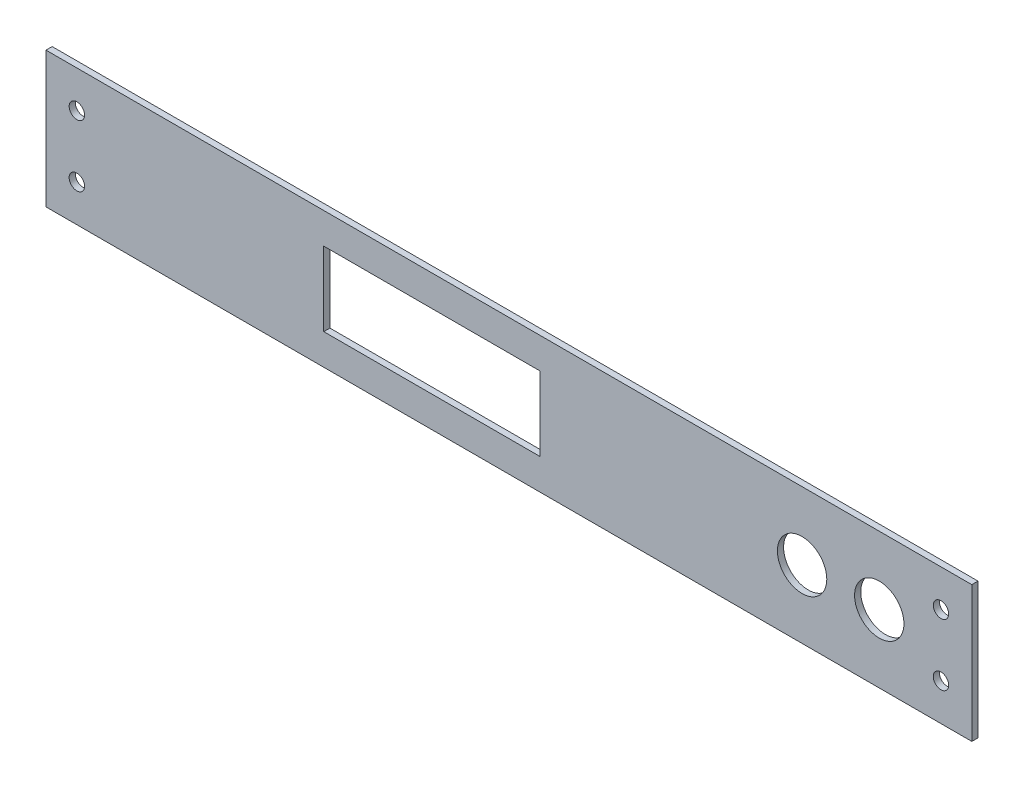
ISO-10303-21;
HEADER;
FILE_DESCRIPTION(('STEP AP214'),'2;1');
FILE_NAME('part.step','',(''),(''),'','','');
FILE_SCHEMA(('AUTOMOTIVE_DESIGN { 1 0 10303 214 1 1 1 1 }'));
ENDSEC;
DATA;
#1=APPLICATION_CONTEXT('core data for automotive mechanical design processes');
#2=APPLICATION_PROTOCOL_DEFINITION('international standard','automotive_design',2000,#1);
#3=PRODUCT_CONTEXT('',#1,'mechanical');
#4=PRODUCT('Part','Part','',(#3));
#5=PRODUCT_RELATED_PRODUCT_CATEGORY('part','',(#4));
#6=PRODUCT_DEFINITION_FORMATION('','',#4);
#7=PRODUCT_DEFINITION_CONTEXT('part definition',#1,'design');
#8=PRODUCT_DEFINITION('design','',#6,#7);
#9=PRODUCT_DEFINITION_SHAPE('','',#8);
#10=(LENGTH_UNIT() NAMED_UNIT(*) SI_UNIT(.MILLI.,.METRE.));
#11=(NAMED_UNIT(*) PLANE_ANGLE_UNIT() SI_UNIT($,.RADIAN.));
#12=(NAMED_UNIT(*) SI_UNIT($,.STERADIAN.) SOLID_ANGLE_UNIT());
#13=UNCERTAINTY_MEASURE_WITH_UNIT(LENGTH_MEASURE(1.E-05),#10,'distance_accuracy_value','');
#14=(GEOMETRIC_REPRESENTATION_CONTEXT(3) GLOBAL_UNCERTAINTY_ASSIGNED_CONTEXT((#13)) GLOBAL_UNIT_ASSIGNED_CONTEXT((#10,
#11,#12)) REPRESENTATION_CONTEXT('',''));
#15=CARTESIAN_POINT('',(0.,0.,0.));
#16=DIRECTION('',(0.,0.,1.));
#17=DIRECTION('',(1.,0.,0.));
#18=AXIS2_PLACEMENT_3D('',#15,#16,#17);
#19=CARTESIAN_POINT('',(0.,0.,2.));
#20=DIRECTION('',(0.,0.,1.));
#21=DIRECTION('',(1.,0.,0.));
#22=AXIS2_PLACEMENT_3D('',#19,#20,#21);
#23=PLANE('',#22);
#24=CARTESIAN_POINT('',(225.905203177465,-9.36652487204221,2.));
#25=DIRECTION('',(0.,0.,1.));
#26=DIRECTION('',(1.,0.,0.));
#27=AXIS2_PLACEMENT_3D('',#24,#25,#26);
#28=CIRCLE('',#27,2.5);
#29=CARTESIAN_POINT('',(228.405203177465,-9.36652487204221,2.));
#30=VERTEX_POINT('',#29);
#31=EDGE_CURVE('E242',#30,#30,#28,.T.);
#32=ORIENTED_EDGE('',*,*,#31,.F.);
#33=EDGE_LOOP('',(#32));
#34=FACE_BOUND('',#33,.T.);
#35=CARTESIAN_POINT('',(-54.0947968225353,-9.36652487204221,2.));
#36=DIRECTION('',(0.,0.,1.));
#37=DIRECTION('',(1.,0.,0.));
#38=AXIS2_PLACEMENT_3D('',#35,#36,#37);
#39=CIRCLE('',#38,2.5);
#40=CARTESIAN_POINT('',(-51.5947968225353,-9.36652487204221,2.));
#41=VERTEX_POINT('',#40);
#42=EDGE_CURVE('E126',#41,#41,#39,.T.);
#43=ORIENTED_EDGE('',*,*,#42,.F.);
#44=EDGE_LOOP('',(#43));
#45=FACE_BOUND('',#44,.T.);
#46=CARTESIAN_POINT('',(205.905203177465,0.633475127957785,2.));
#47=DIRECTION('',(0.,0.,1.));
#48=DIRECTION('',(1.,0.,0.));
#49=AXIS2_PLACEMENT_3D('',#46,#47,#48);
#50=CIRCLE('',#49,8.00000000000001);
#51=CARTESIAN_POINT('',(213.905203177465,0.633475127957785,2.));
#52=VERTEX_POINT('',#51);
#53=EDGE_CURVE('E136',#52,#52,#50,.T.);
#54=ORIENTED_EDGE('',*,*,#53,.F.);
#55=EDGE_LOOP('',(#54));
#56=FACE_BOUND('',#55,.T.);
#57=DIRECTION('',(0.,-1.,0.));
#58=VECTOR('',#57,1.);
#59=CARTESIAN_POINT('',(-64.0947968225353,22.6334751279578,2.));
#60=LINE('',#59,#58);
#61=CARTESIAN_POINT('',(-64.0947968225353,22.6334751279578,2.));
#62=VERTEX_POINT('',#61);
#63=CARTESIAN_POINT('',(-64.0947968225353,-21.3665248720422,2.));
#64=VERTEX_POINT('',#63);
#65=EDGE_CURVE('E148',#62,#64,#60,.T.);
#66=ORIENTED_EDGE('',*,*,#65,.T.);
#67=DIRECTION('',(1.,0.,0.));
#68=VECTOR('',#67,1.);
#69=CARTESIAN_POINT('',(-64.0947968225353,-21.3665248720422,2.));
#70=LINE('',#69,#68);
#71=CARTESIAN_POINT('',(235.905203177465,-21.3665248720422,2.));
#72=VERTEX_POINT('',#71);
#73=EDGE_CURVE('E151',#64,#72,#70,.T.);
#74=ORIENTED_EDGE('',*,*,#73,.T.);
#75=DIRECTION('',(0.,1.,0.));
#76=VECTOR('',#75,1.);
#77=CARTESIAN_POINT('',(235.905203177465,22.6334751279578,2.));
#78=LINE('',#77,#76);
#79=CARTESIAN_POINT('',(235.905203177465,22.6334751279578,2.));
#80=VERTEX_POINT('',#79);
#81=EDGE_CURVE('E154',#72,#80,#78,.T.);
#82=ORIENTED_EDGE('',*,*,#81,.T.);
#83=DIRECTION('',(-1.,0.,0.));
#84=VECTOR('',#83,1.);
#85=CARTESIAN_POINT('',(-64.0947968225353,22.6334751279578,2.));
#86=LINE('',#85,#84);
#87=EDGE_CURVE('E156',#80,#62,#86,.T.);
#88=ORIENTED_EDGE('',*,*,#87,.T.);
#89=EDGE_LOOP('',(#66,#74,#82,#88));
#90=FACE_BOUND('',#89,.T.);
#91=CARTESIAN_POINT('',(-54.0947968225353,10.6334751279578,2.));
#92=DIRECTION('',(0.,0.,1.));
#93=DIRECTION('',(1.,0.,0.));
#94=AXIS2_PLACEMENT_3D('',#91,#92,#93);
#95=CIRCLE('',#94,2.5);
#96=CARTESIAN_POINT('',(-51.5947968225353,10.6334751279578,2.));
#97=VERTEX_POINT('',#96);
#98=EDGE_CURVE('E142',#97,#97,#95,.T.);
#99=ORIENTED_EDGE('',*,*,#98,.F.);
#100=EDGE_LOOP('',(#99));
#101=FACE_BOUND('',#100,.T.);
#102=DIRECTION('',(1.,0.,0.));
#103=VECTOR('',#102,1.);
#104=CARTESIAN_POINT('',(25.9052031774647,-11.3665248720422,2.));
#105=LINE('',#104,#103);
#106=CARTESIAN_POINT('',(25.9052031774647,-11.3665248720422,2.));
#107=VERTEX_POINT('',#106);
#108=CARTESIAN_POINT('',(95.9052031774647,-11.3665248720422,2.));
#109=VERTEX_POINT('',#108);
#110=EDGE_CURVE('E105',#107,#109,#105,.T.);
#111=ORIENTED_EDGE('',*,*,#110,.F.);
#112=DIRECTION('',(0.,-1.,0.));
#113=VECTOR('',#112,1.);
#114=CARTESIAN_POINT('',(25.9052031774647,-11.3665248720422,2.));
#115=LINE('',#114,#113);
#116=CARTESIAN_POINT('',(25.9052031774647,12.6334751279578,2.));
#117=VERTEX_POINT('',#116);
#118=EDGE_CURVE('E97',#117,#107,#115,.T.);
#119=ORIENTED_EDGE('',*,*,#118,.F.);
#120=DIRECTION('',(-1.,0.,0.));
#121=VECTOR('',#120,1.);
#122=CARTESIAN_POINT('',(25.9052031774647,12.6334751279578,2.));
#123=LINE('',#122,#121);
#124=CARTESIAN_POINT('',(95.9052031774647,12.6334751279578,2.));
#125=VERTEX_POINT('',#124);
#126=EDGE_CURVE('E120',#125,#117,#123,.T.);
#127=ORIENTED_EDGE('',*,*,#126,.F.);
#128=DIRECTION('',(0.,1.,0.));
#129=VECTOR('',#128,1.);
#130=CARTESIAN_POINT('',(95.9052031774647,12.6334751279578,2.));
#131=LINE('',#130,#129);
#132=EDGE_CURVE('E118',#109,#125,#131,.T.);
#133=ORIENTED_EDGE('',*,*,#132,.F.);
#134=EDGE_LOOP('',(#111,#119,#127,#133));
#135=FACE_BOUND('',#134,.T.);
#136=CARTESIAN_POINT('',(225.905203177465,10.6334751279578,2.));
#137=DIRECTION('',(0.,0.,1.));
#138=DIRECTION('',(1.,0.,0.));
#139=AXIS2_PLACEMENT_3D('',#136,#137,#138);
#140=CIRCLE('',#139,2.5);
#141=CARTESIAN_POINT('',(228.405203177465,10.6334751279578,2.));
#142=VERTEX_POINT('',#141);
#143=EDGE_CURVE('E247',#142,#142,#140,.T.);
#144=ORIENTED_EDGE('',*,*,#143,.F.);
#145=EDGE_LOOP('',(#144));
#146=FACE_BOUND('',#145,.T.);
#147=CARTESIAN_POINT('',(180.905203177465,0.633475127957782,2.));
#148=DIRECTION('',(0.,0.,1.));
#149=DIRECTION('',(1.,0.,0.));
#150=AXIS2_PLACEMENT_3D('',#147,#148,#149);
#151=CIRCLE('',#150,8.00000000000001);
#152=CARTESIAN_POINT('',(188.905203177465,0.633475127957782,2.));
#153=VERTEX_POINT('',#152);
#154=EDGE_CURVE('E236',#153,#153,#151,.T.);
#155=ORIENTED_EDGE('',*,*,#154,.F.);
#156=EDGE_LOOP('',(#155));
#157=FACE_BOUND('',#156,.T.);
#158=ADVANCED_FACE('F32',(#34,#45,#56,#90,#101,#135,#146,#157),#23,.T.);
#159=CARTESIAN_POINT('',(0.,0.,0.));
#160=DIRECTION('',(0.,0.,1.));
#161=DIRECTION('',(1.,0.,0.));
#162=AXIS2_PLACEMENT_3D('',#159,#160,#161);
#163=PLANE('',#162);
#164=CARTESIAN_POINT('',(225.905203177465,-9.36652487204221,0.));
#165=DIRECTION('',(0.,0.,1.));
#166=DIRECTION('',(1.,0.,0.));
#167=AXIS2_PLACEMENT_3D('',#164,#165,#166);
#168=CIRCLE('',#167,2.5);
#169=CARTESIAN_POINT('',(228.405203177465,-9.36652487204221,0.));
#170=VERTEX_POINT('',#169);
#171=EDGE_CURVE('E239',#170,#170,#168,.T.);
#172=ORIENTED_EDGE('',*,*,#171,.T.);
#173=EDGE_LOOP('',(#172));
#174=FACE_BOUND('',#173,.T.);
#175=CARTESIAN_POINT('',(-54.0947968225353,-9.36652487204221,0.));
#176=DIRECTION('',(0.,0.,1.));
#177=DIRECTION('',(1.,0.,0.));
#178=AXIS2_PLACEMENT_3D('',#175,#176,#177);
#179=CIRCLE('',#178,2.5);
#180=CARTESIAN_POINT('',(-51.5947968225353,-9.36652487204221,0.));
#181=VERTEX_POINT('',#180);
#182=EDGE_CURVE('E250',#181,#181,#179,.T.);
#183=ORIENTED_EDGE('',*,*,#182,.T.);
#184=EDGE_LOOP('',(#183));
#185=FACE_BOUND('',#184,.T.);
#186=CARTESIAN_POINT('',(205.905203177465,0.633475127957785,0.));
#187=DIRECTION('',(0.,0.,1.));
#188=DIRECTION('',(1.,0.,0.));
#189=AXIS2_PLACEMENT_3D('',#186,#187,#188);
#190=CIRCLE('',#189,8.00000000000001);
#191=CARTESIAN_POINT('',(213.905203177465,0.633475127957785,0.));
#192=VERTEX_POINT('',#191);
#193=EDGE_CURVE('E113',#192,#192,#190,.T.);
#194=ORIENTED_EDGE('',*,*,#193,.T.);
#195=EDGE_LOOP('',(#194));
#196=FACE_BOUND('',#195,.T.);
#197=DIRECTION('',(0.,-1.,0.));
#198=VECTOR('',#197,1.);
#199=CARTESIAN_POINT('',(-64.0947968225353,22.6334751279578,0.));
#200=LINE('',#199,#198);
#201=CARTESIAN_POINT('',(-64.0947968225353,22.6334751279578,0.));
#202=VERTEX_POINT('',#201);
#203=CARTESIAN_POINT('',(-64.0947968225353,-21.3665248720422,0.));
#204=VERTEX_POINT('',#203);
#205=EDGE_CURVE('E145',#202,#204,#200,.T.);
#206=ORIENTED_EDGE('',*,*,#205,.F.);
#207=DIRECTION('',(-1.,0.,0.));
#208=VECTOR('',#207,1.);
#209=CARTESIAN_POINT('',(-64.0947968225353,22.6334751279578,0.));
#210=LINE('',#209,#208);
#211=CARTESIAN_POINT('',(235.905203177465,22.6334751279578,0.));
#212=VERTEX_POINT('',#211);
#213=EDGE_CURVE('E152',#212,#202,#210,.T.);
#214=ORIENTED_EDGE('',*,*,#213,.F.);
#215=DIRECTION('',(0.,1.,0.));
#216=VECTOR('',#215,1.);
#217=CARTESIAN_POINT('',(235.905203177465,22.6334751279578,0.));
#218=LINE('',#217,#216);
#219=CARTESIAN_POINT('',(235.905203177465,-21.3665248720422,0.));
#220=VERTEX_POINT('',#219);
#221=EDGE_CURVE('E163',#220,#212,#218,.T.);
#222=ORIENTED_EDGE('',*,*,#221,.F.);
#223=DIRECTION('',(1.,0.,0.));
#224=VECTOR('',#223,1.);
#225=CARTESIAN_POINT('',(-64.0947968225353,-21.3665248720422,0.));
#226=LINE('',#225,#224);
#227=EDGE_CURVE('E161',#204,#220,#226,.T.);
#228=ORIENTED_EDGE('',*,*,#227,.F.);
#229=EDGE_LOOP('',(#206,#214,#222,#228));
#230=FACE_BOUND('',#229,.T.);
#231=CARTESIAN_POINT('',(-54.0947968225353,10.6334751279578,0.));
#232=DIRECTION('',(0.,0.,1.));
#233=DIRECTION('',(1.,0.,0.));
#234=AXIS2_PLACEMENT_3D('',#231,#232,#233);
#235=CIRCLE('',#234,2.5);
#236=CARTESIAN_POINT('',(-51.5947968225353,10.6334751279578,0.));
#237=VERTEX_POINT('',#236);
#238=EDGE_CURVE('E139',#237,#237,#235,.T.);
#239=ORIENTED_EDGE('',*,*,#238,.T.);
#240=EDGE_LOOP('',(#239));
#241=FACE_BOUND('',#240,.T.);
#242=DIRECTION('',(0.,-1.,0.));
#243=VECTOR('',#242,1.);
#244=CARTESIAN_POINT('',(25.9052031774647,-11.3665248720422,0.));
#245=LINE('',#244,#243);
#246=CARTESIAN_POINT('',(25.9052031774647,12.6334751279578,0.));
#247=VERTEX_POINT('',#246);
#248=CARTESIAN_POINT('',(25.9052031774647,-11.3665248720422,0.));
#249=VERTEX_POINT('',#248);
#250=EDGE_CURVE('E55',#247,#249,#245,.T.);
#251=ORIENTED_EDGE('',*,*,#250,.T.);
#252=DIRECTION('',(1.,0.,0.));
#253=VECTOR('',#252,1.);
#254=CARTESIAN_POINT('',(25.9052031774647,-11.3665248720422,0.));
#255=LINE('',#254,#253);
#256=CARTESIAN_POINT('',(95.9052031774647,-11.3665248720422,0.));
#257=VERTEX_POINT('',#256);
#258=EDGE_CURVE('E112',#249,#257,#255,.T.);
#259=ORIENTED_EDGE('',*,*,#258,.T.);
#260=DIRECTION('',(0.,1.,0.));
#261=VECTOR('',#260,1.);
#262=CARTESIAN_POINT('',(95.9052031774647,12.6334751279578,0.));
#263=LINE('',#262,#261);
#264=CARTESIAN_POINT('',(95.9052031774647,12.6334751279578,0.));
#265=VERTEX_POINT('',#264);
#266=EDGE_CURVE('E128',#257,#265,#263,.T.);
#267=ORIENTED_EDGE('',*,*,#266,.T.);
#268=DIRECTION('',(-1.,0.,0.));
#269=VECTOR('',#268,1.);
#270=CARTESIAN_POINT('',(25.9052031774647,12.6334751279578,0.));
#271=LINE('',#270,#269);
#272=EDGE_CURVE('E106',#265,#247,#271,.T.);
#273=ORIENTED_EDGE('',*,*,#272,.T.);
#274=EDGE_LOOP('',(#251,#259,#267,#273));
#275=FACE_BOUND('',#274,.T.);
#276=CARTESIAN_POINT('',(225.905203177465,10.6334751279578,0.));
#277=DIRECTION('',(0.,0.,1.));
#278=DIRECTION('',(1.,0.,0.));
#279=AXIS2_PLACEMENT_3D('',#276,#277,#278);
#280=CIRCLE('',#279,2.5);
#281=CARTESIAN_POINT('',(228.405203177465,10.6334751279578,0.));
#282=VERTEX_POINT('',#281);
#283=EDGE_CURVE('E231',#282,#282,#280,.T.);
#284=ORIENTED_EDGE('',*,*,#283,.T.);
#285=EDGE_LOOP('',(#284));
#286=FACE_BOUND('',#285,.T.);
#287=CARTESIAN_POINT('',(180.905203177465,0.633475127957782,0.));
#288=DIRECTION('',(0.,0.,1.));
#289=DIRECTION('',(1.,0.,0.));
#290=AXIS2_PLACEMENT_3D('',#287,#288,#289);
#291=CIRCLE('',#290,8.00000000000001);
#292=CARTESIAN_POINT('',(188.905203177465,0.633475127957782,0.));
#293=VERTEX_POINT('',#292);
#294=EDGE_CURVE('E234',#293,#293,#291,.T.);
#295=ORIENTED_EDGE('',*,*,#294,.T.);
#296=EDGE_LOOP('',(#295));
#297=FACE_BOUND('',#296,.T.);
#298=ADVANCED_FACE('F181',(#174,#185,#196,#230,#241,#275,#286,#297),#163,.F.);
#299=CARTESIAN_POINT('',(-64.0947968225353,22.6334751279578,2.));
#300=DIRECTION('',(1.,0.,0.));
#301=DIRECTION('',(0.,0.,-1.));
#302=AXIS2_PLACEMENT_3D('',#299,#300,#301);
#303=PLANE('',#302);
#304=ORIENTED_EDGE('',*,*,#205,.T.);
#305=DIRECTION('',(0.,0.,-1.));
#306=VECTOR('',#305,1.);
#307=CARTESIAN_POINT('',(-64.0947968225353,-21.3665248720422,2.));
#308=LINE('',#307,#306);
#309=EDGE_CURVE('E11',#64,#204,#308,.T.);
#310=ORIENTED_EDGE('',*,*,#309,.F.);
#311=ORIENTED_EDGE('',*,*,#65,.F.);
#312=DIRECTION('',(0.,0.,-1.));
#313=VECTOR('',#312,1.);
#314=CARTESIAN_POINT('',(-64.0947968225353,22.6334751279578,2.));
#315=LINE('',#314,#313);
#316=EDGE_CURVE('E158',#62,#202,#315,.T.);
#317=ORIENTED_EDGE('',*,*,#316,.T.);
#318=EDGE_LOOP('',(#304,#310,#311,#317));
#319=FACE_BOUND('',#318,.T.);
#320=ADVANCED_FACE('F34',(#319),#303,.F.);
#321=CARTESIAN_POINT('',(-64.0947968225353,-21.3665248720422,2.));
#322=DIRECTION('',(0.,1.,0.));
#323=DIRECTION('',(0.,0.,1.));
#324=AXIS2_PLACEMENT_3D('',#321,#322,#323);
#325=PLANE('',#324);
#326=ORIENTED_EDGE('',*,*,#227,.T.);
#327=DIRECTION('',(0.,0.,-1.));
#328=VECTOR('',#327,1.);
#329=CARTESIAN_POINT('',(235.905203177465,-21.3665248720422,2.));
#330=LINE('',#329,#328);
#331=EDGE_CURVE('E40',#72,#220,#330,.T.);
#332=ORIENTED_EDGE('',*,*,#331,.F.);
#333=ORIENTED_EDGE('',*,*,#73,.F.);
#334=ORIENTED_EDGE('',*,*,#309,.T.);
#335=EDGE_LOOP('',(#326,#332,#333,#334));
#336=FACE_BOUND('',#335,.T.);
#337=ADVANCED_FACE('F192',(#336),#325,.F.);
#338=CARTESIAN_POINT('',(235.905203177465,22.6334751279578,2.));
#339=DIRECTION('',(-1.,0.,0.));
#340=DIRECTION('',(0.,0.,1.));
#341=AXIS2_PLACEMENT_3D('',#338,#339,#340);
#342=PLANE('',#341);
#343=ORIENTED_EDGE('',*,*,#221,.T.);
#344=DIRECTION('',(0.,0.,-1.));
#345=VECTOR('',#344,1.);
#346=CARTESIAN_POINT('',(235.905203177465,22.6334751279578,2.));
#347=LINE('',#346,#345);
#348=EDGE_CURVE('E168',#80,#212,#347,.T.);
#349=ORIENTED_EDGE('',*,*,#348,.F.);
#350=ORIENTED_EDGE('',*,*,#81,.F.);
#351=ORIENTED_EDGE('',*,*,#331,.T.);
#352=EDGE_LOOP('',(#343,#349,#350,#351));
#353=FACE_BOUND('',#352,.T.);
#354=ADVANCED_FACE('F175',(#353),#342,.F.);
#355=CARTESIAN_POINT('',(-64.0947968225353,22.6334751279578,2.));
#356=DIRECTION('',(0.,-1.,0.));
#357=DIRECTION('',(0.,0.,-1.));
#358=AXIS2_PLACEMENT_3D('',#355,#356,#357);
#359=PLANE('',#358);
#360=ORIENTED_EDGE('',*,*,#213,.T.);
#361=ORIENTED_EDGE('',*,*,#316,.F.);
#362=ORIENTED_EDGE('',*,*,#87,.F.);
#363=ORIENTED_EDGE('',*,*,#348,.T.);
#364=EDGE_LOOP('',(#360,#361,#362,#363));
#365=FACE_BOUND('',#364,.T.);
#366=ADVANCED_FACE('F185',(#365),#359,.F.);
#367=CARTESIAN_POINT('',(-54.0947968225353,10.6334751279578,2.));
#368=DIRECTION('',(0.,0.,-1.));
#369=DIRECTION('',(-1.,0.,0.));
#370=AXIS2_PLACEMENT_3D('',#367,#368,#369);
#371=CYLINDRICAL_SURFACE('',#370,2.5);
#372=ORIENTED_EDGE('',*,*,#98,.T.);
#373=EDGE_LOOP('',(#372));
#374=FACE_BOUND('',#373,.T.);
#375=ORIENTED_EDGE('',*,*,#238,.F.);
#376=EDGE_LOOP('',(#375));
#377=FACE_BOUND('',#376,.T.);
#378=ADVANCED_FACE('F210',(#374,#377),#371,.F.);
#379=CARTESIAN_POINT('',(205.905203177465,0.633475127957785,2.));
#380=DIRECTION('',(0.,0.,-1.));
#381=DIRECTION('',(-1.,0.,0.));
#382=AXIS2_PLACEMENT_3D('',#379,#380,#381);
#383=CYLINDRICAL_SURFACE('',#382,8.00000000000001);
#384=ORIENTED_EDGE('',*,*,#53,.T.);
#385=EDGE_LOOP('',(#384));
#386=FACE_BOUND('',#385,.T.);
#387=ORIENTED_EDGE('',*,*,#193,.F.);
#388=EDGE_LOOP('',(#387));
#389=FACE_BOUND('',#388,.T.);
#390=ADVANCED_FACE('F217',(#386,#389),#383,.F.);
#391=CARTESIAN_POINT('',(25.9052031774647,-11.3665248720422,2.));
#392=DIRECTION('',(1.,0.,0.));
#393=DIRECTION('',(0.,0.,-1.));
#394=AXIS2_PLACEMENT_3D('',#391,#392,#393);
#395=PLANE('',#394);
#396=ORIENTED_EDGE('',*,*,#250,.F.);
#397=DIRECTION('',(0.,0.,-1.));
#398=VECTOR('',#397,1.);
#399=CARTESIAN_POINT('',(25.9052031774647,12.6334751279578,2.));
#400=LINE('',#399,#398);
#401=EDGE_CURVE('E101',#117,#247,#400,.T.);
#402=ORIENTED_EDGE('',*,*,#401,.F.);
#403=ORIENTED_EDGE('',*,*,#118,.T.);
#404=DIRECTION('',(0.,0.,-1.));
#405=VECTOR('',#404,1.);
#406=CARTESIAN_POINT('',(25.9052031774647,-11.3665248720422,2.));
#407=LINE('',#406,#405);
#408=EDGE_CURVE('E100',#107,#249,#407,.T.);
#409=ORIENTED_EDGE('',*,*,#408,.T.);
#410=EDGE_LOOP('',(#396,#402,#403,#409));
#411=FACE_BOUND('',#410,.T.);
#412=ADVANCED_FACE('F99',(#411),#395,.T.);
#413=CARTESIAN_POINT('',(25.9052031774647,-11.3665248720422,2.));
#414=DIRECTION('',(0.,1.,0.));
#415=DIRECTION('',(0.,0.,1.));
#416=AXIS2_PLACEMENT_3D('',#413,#414,#415);
#417=PLANE('',#416);
#418=ORIENTED_EDGE('',*,*,#258,.F.);
#419=ORIENTED_EDGE('',*,*,#408,.F.);
#420=ORIENTED_EDGE('',*,*,#110,.T.);
#421=DIRECTION('',(0.,0.,-1.));
#422=VECTOR('',#421,1.);
#423=CARTESIAN_POINT('',(95.9052031774647,-11.3665248720422,2.));
#424=LINE('',#423,#422);
#425=EDGE_CURVE('E114',#109,#257,#424,.T.);
#426=ORIENTED_EDGE('',*,*,#425,.T.);
#427=EDGE_LOOP('',(#418,#419,#420,#426));
#428=FACE_BOUND('',#427,.T.);
#429=ADVANCED_FACE('F109',(#428),#417,.T.);
#430=CARTESIAN_POINT('',(95.9052031774647,12.6334751279578,2.));
#431=DIRECTION('',(-1.,0.,0.));
#432=DIRECTION('',(0.,0.,1.));
#433=AXIS2_PLACEMENT_3D('',#430,#431,#432);
#434=PLANE('',#433);
#435=ORIENTED_EDGE('',*,*,#266,.F.);
#436=ORIENTED_EDGE('',*,*,#425,.F.);
#437=ORIENTED_EDGE('',*,*,#132,.T.);
#438=DIRECTION('',(0.,0.,-1.));
#439=VECTOR('',#438,1.);
#440=CARTESIAN_POINT('',(95.9052031774647,12.6334751279578,2.));
#441=LINE('',#440,#439);
#442=EDGE_CURVE('E47',#125,#265,#441,.T.);
#443=ORIENTED_EDGE('',*,*,#442,.T.);
#444=EDGE_LOOP('',(#435,#436,#437,#443));
#445=FACE_BOUND('',#444,.T.);
#446=ADVANCED_FACE('F271',(#445),#434,.T.);
#447=CARTESIAN_POINT('',(25.9052031774647,12.6334751279578,2.));
#448=DIRECTION('',(0.,-1.,0.));
#449=DIRECTION('',(0.,0.,-1.));
#450=AXIS2_PLACEMENT_3D('',#447,#448,#449);
#451=PLANE('',#450);
#452=ORIENTED_EDGE('',*,*,#272,.F.);
#453=ORIENTED_EDGE('',*,*,#442,.F.);
#454=ORIENTED_EDGE('',*,*,#126,.T.);
#455=ORIENTED_EDGE('',*,*,#401,.T.);
#456=EDGE_LOOP('',(#452,#453,#454,#455));
#457=FACE_BOUND('',#456,.T.);
#458=ADVANCED_FACE('F261',(#457),#451,.T.);
#459=CARTESIAN_POINT('',(-54.0947968225353,-9.36652487204221,2.));
#460=DIRECTION('',(0.,0.,-1.));
#461=DIRECTION('',(-1.,0.,0.));
#462=AXIS2_PLACEMENT_3D('',#459,#460,#461);
#463=CYLINDRICAL_SURFACE('',#462,2.5);
#464=ORIENTED_EDGE('',*,*,#42,.T.);
#465=EDGE_LOOP('',(#464));
#466=FACE_BOUND('',#465,.T.);
#467=ORIENTED_EDGE('',*,*,#182,.F.);
#468=EDGE_LOOP('',(#467));
#469=FACE_BOUND('',#468,.T.);
#470=ADVANCED_FACE('F258',(#466,#469),#463,.F.);
#471=CARTESIAN_POINT('',(225.905203177465,10.6334751279578,2.));
#472=DIRECTION('',(0.,0.,-1.));
#473=DIRECTION('',(-1.,0.,0.));
#474=AXIS2_PLACEMENT_3D('',#471,#472,#473);
#475=CYLINDRICAL_SURFACE('',#474,2.5);
#476=ORIENTED_EDGE('',*,*,#143,.T.);
#477=EDGE_LOOP('',(#476));
#478=FACE_BOUND('',#477,.T.);
#479=ORIENTED_EDGE('',*,*,#283,.F.);
#480=EDGE_LOOP('',(#479));
#481=FACE_BOUND('',#480,.T.);
#482=ADVANCED_FACE('F260',(#478,#481),#475,.F.);
#483=CARTESIAN_POINT('',(225.905203177465,-9.36652487204221,2.));
#484=DIRECTION('',(0.,0.,-1.));
#485=DIRECTION('',(-1.,0.,0.));
#486=AXIS2_PLACEMENT_3D('',#483,#484,#485);
#487=CYLINDRICAL_SURFACE('',#486,2.5);
#488=ORIENTED_EDGE('',*,*,#31,.T.);
#489=EDGE_LOOP('',(#488));
#490=FACE_BOUND('',#489,.T.);
#491=ORIENTED_EDGE('',*,*,#171,.F.);
#492=EDGE_LOOP('',(#491));
#493=FACE_BOUND('',#492,.T.);
#494=ADVANCED_FACE('F268',(#490,#493),#487,.F.);
#495=CARTESIAN_POINT('',(180.905203177465,0.633475127957782,2.));
#496=DIRECTION('',(0.,0.,-1.));
#497=DIRECTION('',(-1.,0.,0.));
#498=AXIS2_PLACEMENT_3D('',#495,#496,#497);
#499=CYLINDRICAL_SURFACE('',#498,8.00000000000001);
#500=ORIENTED_EDGE('',*,*,#154,.T.);
#501=EDGE_LOOP('',(#500));
#502=FACE_BOUND('',#501,.T.);
#503=ORIENTED_EDGE('',*,*,#294,.F.);
#504=EDGE_LOOP('',(#503));
#505=FACE_BOUND('',#504,.T.);
#506=ADVANCED_FACE('F316',(#502,#505),#499,.F.);
#507=CLOSED_SHELL('',(#158,#298,#320,#337,#354,#366,#378,#390,#412,#429,#446,#458,#470,#482,
#494,#506));
#508=MANIFOLD_SOLID_BREP('B2',#507);
#509=ADVANCED_BREP_SHAPE_REPRESENTATION('',(#18,#508),#14);
#510=SHAPE_DEFINITION_REPRESENTATION(#9,#509);
ENDSEC;
END-ISO-10303-21;
